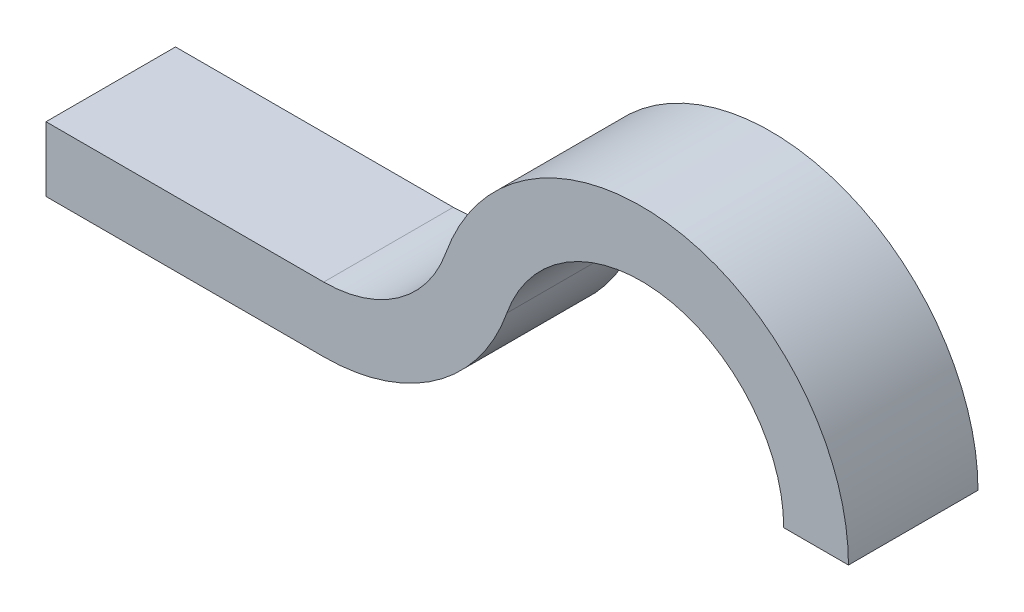
ISO-10303-21;
HEADER;
FILE_DESCRIPTION(('STEP AP214'),'2;1');
FILE_NAME('part.step','',(''),(''),'','','');
FILE_SCHEMA(('AUTOMOTIVE_DESIGN { 1 0 10303 214 1 1 1 1 }'));
ENDSEC;
DATA;
#1=APPLICATION_CONTEXT('core data for automotive mechanical design processes');
#2=APPLICATION_PROTOCOL_DEFINITION('international standard','automotive_design',2000,#1);
#3=PRODUCT_CONTEXT('',#1,'mechanical');
#4=PRODUCT('Part','Part','',(#3));
#5=PRODUCT_RELATED_PRODUCT_CATEGORY('part','',(#4));
#6=PRODUCT_DEFINITION_FORMATION('','',#4);
#7=PRODUCT_DEFINITION_CONTEXT('part definition',#1,'design');
#8=PRODUCT_DEFINITION('design','',#6,#7);
#9=PRODUCT_DEFINITION_SHAPE('','',#8);
#10=(LENGTH_UNIT() NAMED_UNIT(*) SI_UNIT(.MILLI.,.METRE.));
#11=(NAMED_UNIT(*) PLANE_ANGLE_UNIT() SI_UNIT($,.RADIAN.));
#12=(NAMED_UNIT(*) SI_UNIT($,.STERADIAN.) SOLID_ANGLE_UNIT());
#13=UNCERTAINTY_MEASURE_WITH_UNIT(LENGTH_MEASURE(1.E-05),#10,'distance_accuracy_value','');
#14=(GEOMETRIC_REPRESENTATION_CONTEXT(3) GLOBAL_UNCERTAINTY_ASSIGNED_CONTEXT((#13)) GLOBAL_UNIT_ASSIGNED_CONTEXT((#10,
#11,#12)) REPRESENTATION_CONTEXT('',''));
#15=CARTESIAN_POINT('',(0.,0.,0.));
#16=DIRECTION('',(0.,0.,1.));
#17=DIRECTION('',(1.,0.,0.));
#18=AXIS2_PLACEMENT_3D('',#15,#16,#17);
#19=CARTESIAN_POINT('',(0.,0.,10.));
#20=DIRECTION('',(0.,0.,-1.));
#21=DIRECTION('',(-1.,0.,0.));
#22=AXIS2_PLACEMENT_3D('',#19,#20,#21);
#23=CYLINDRICAL_SURFACE('',#22,16.);
#24=CARTESIAN_POINT('',(0.,0.,0.));
#25=DIRECTION('',(0.,0.,1.));
#26=DIRECTION('',(-1.,0.,0.));
#27=AXIS2_PLACEMENT_3D('',#24,#25,#26);
#28=CIRCLE('',#27,16.);
#29=CARTESIAN_POINT('',(16.,0.,0.));
#30=VERTEX_POINT('',#29);
#31=CARTESIAN_POINT('',(-15.084944665313,5.33333333333333,0.));
#32=VERTEX_POINT('',#31);
#33=EDGE_CURVE('E133',#30,#32,#28,.T.);
#34=ORIENTED_EDGE('',*,*,#33,.T.);
#35=DIRECTION('',(0.,0.,-1.));
#36=VECTOR('',#35,1.);
#37=CARTESIAN_POINT('',(-15.084944665313,5.33333333333333,10.));
#38=LINE('',#37,#36);
#39=CARTESIAN_POINT('',(-15.084944665313,5.33333333333333,10.));
#40=VERTEX_POINT('',#39);
#41=EDGE_CURVE('E11',#40,#32,#38,.T.);
#42=ORIENTED_EDGE('',*,*,#41,.F.);
#43=CARTESIAN_POINT('',(0.,0.,10.));
#44=DIRECTION('',(0.,0.,1.));
#45=DIRECTION('',(-1.,0.,0.));
#46=AXIS2_PLACEMENT_3D('',#43,#44,#45);
#47=CIRCLE('',#46,16.);
#48=CARTESIAN_POINT('',(16.,0.,10.));
#49=VERTEX_POINT('',#48);
#50=EDGE_CURVE('E147',#49,#40,#47,.T.);
#51=ORIENTED_EDGE('',*,*,#50,.F.);
#52=DIRECTION('',(0.,0.,-1.));
#53=VECTOR('',#52,1.);
#54=CARTESIAN_POINT('',(16.,0.,10.));
#55=LINE('',#54,#53);
#56=EDGE_CURVE('E129',#49,#30,#55,.T.);
#57=ORIENTED_EDGE('',*,*,#56,.T.);
#58=EDGE_LOOP('',(#34,#42,#51,#57));
#59=FACE_BOUND('',#58,.T.);
#60=ADVANCED_FACE('F37',(#59),#23,.T.);
#61=CARTESIAN_POINT('',(-24.5130350811337,8.66666666666667,10.));
#62=DIRECTION('',(0.,0.,-1.));
#63=DIRECTION('',(-1.,0.,0.));
#64=AXIS2_PLACEMENT_3D('',#61,#62,#63);
#65=CYLINDRICAL_SURFACE('',#64,10.);
#66=CARTESIAN_POINT('',(-24.5130350811337,8.66666666666667,0.));
#67=DIRECTION('',(0.,0.,-1.));
#68=DIRECTION('',(-1.,0.,0.));
#69=AXIS2_PLACEMENT_3D('',#66,#67,#68);
#70=CIRCLE('',#69,10.);
#71=CARTESIAN_POINT('',(-24.5130350811337,-1.33333333333333,0.));
#72=VERTEX_POINT('',#71);
#73=EDGE_CURVE('E136',#32,#72,#70,.T.);
#74=ORIENTED_EDGE('',*,*,#73,.T.);
#75=DIRECTION('',(0.,0.,-1.));
#76=VECTOR('',#75,1.);
#77=CARTESIAN_POINT('',(-24.5130350811337,-1.33333333333333,10.));
#78=LINE('',#77,#76);
#79=CARTESIAN_POINT('',(-24.5130350811337,-1.33333333333333,10.));
#80=VERTEX_POINT('',#79);
#81=EDGE_CURVE('E45',#80,#72,#78,.T.);
#82=ORIENTED_EDGE('',*,*,#81,.F.);
#83=CARTESIAN_POINT('',(-24.5130350811337,8.66666666666667,10.));
#84=DIRECTION('',(0.,0.,-1.));
#85=DIRECTION('',(-1.,0.,0.));
#86=AXIS2_PLACEMENT_3D('',#83,#84,#85);
#87=CIRCLE('',#86,10.);
#88=EDGE_CURVE('E96',#40,#80,#87,.T.);
#89=ORIENTED_EDGE('',*,*,#88,.F.);
#90=ORIENTED_EDGE('',*,*,#41,.T.);
#91=EDGE_LOOP('',(#74,#82,#89,#90));
#92=FACE_BOUND('',#91,.T.);
#93=ADVANCED_FACE('F182',(#92),#65,.F.);
#94=CARTESIAN_POINT('',(-24.5130350811337,-1.33333333333333,10.));
#95=DIRECTION('',(0.,-1.,0.));
#96=DIRECTION('',(1.,0.,0.));
#97=AXIS2_PLACEMENT_3D('',#94,#95,#96);
#98=PLANE('',#97);
#99=DIRECTION('',(-1.,0.,0.));
#100=VECTOR('',#99,1.);
#101=CARTESIAN_POINT('',(-24.5130350811337,-1.33333333333333,0.));
#102=LINE('',#101,#100);
#103=CARTESIAN_POINT('',(-45.9535701403111,-1.33333333333334,0.));
#104=VERTEX_POINT('',#103);
#105=EDGE_CURVE('E138',#72,#104,#102,.T.);
#106=ORIENTED_EDGE('',*,*,#105,.T.);
#107=DIRECTION('',(0.,0.,-1.));
#108=VECTOR('',#107,1.);
#109=CARTESIAN_POINT('',(-45.9535701403111,-1.33333333333334,10.));
#110=LINE('',#109,#108);
#111=CARTESIAN_POINT('',(-45.9535701403111,-1.33333333333334,10.));
#112=VERTEX_POINT('',#111);
#113=EDGE_CURVE('E154',#112,#104,#110,.T.);
#114=ORIENTED_EDGE('',*,*,#113,.F.);
#115=DIRECTION('',(-1.,0.,0.));
#116=VECTOR('',#115,1.);
#117=CARTESIAN_POINT('',(-24.5130350811337,-1.33333333333333,10.));
#118=LINE('',#117,#116);
#119=EDGE_CURVE('E162',#80,#112,#118,.T.);
#120=ORIENTED_EDGE('',*,*,#119,.F.);
#121=ORIENTED_EDGE('',*,*,#81,.T.);
#122=EDGE_LOOP('',(#106,#114,#120,#121));
#123=FACE_BOUND('',#122,.T.);
#124=ADVANCED_FACE('F160',(#123),#98,.F.);
#125=CARTESIAN_POINT('',(-45.9535701403111,-1.33333333333334,10.));
#126=DIRECTION('',(1.,0.,0.));
#127=DIRECTION('',(0.,0.,-1.));
#128=AXIS2_PLACEMENT_3D('',#125,#126,#127);
#129=PLANE('',#128);
#130=DIRECTION('',(0.,-1.,0.));
#131=VECTOR('',#130,1.);
#132=CARTESIAN_POINT('',(-45.9535701403111,-1.33333333333334,0.));
#133=LINE('',#132,#131);
#134=CARTESIAN_POINT('',(-45.9535701403111,-6.33333333333334,0.));
#135=VERTEX_POINT('',#134);
#136=EDGE_CURVE('E140',#104,#135,#133,.T.);
#137=ORIENTED_EDGE('',*,*,#136,.T.);
#138=DIRECTION('',(0.,0.,-1.));
#139=VECTOR('',#138,1.);
#140=CARTESIAN_POINT('',(-45.9535701403111,-6.33333333333334,10.));
#141=LINE('',#140,#139);
#142=CARTESIAN_POINT('',(-45.9535701403111,-6.33333333333334,10.));
#143=VERTEX_POINT('',#142);
#144=EDGE_CURVE('E151',#143,#135,#141,.T.);
#145=ORIENTED_EDGE('',*,*,#144,.F.);
#146=DIRECTION('',(0.,-1.,0.));
#147=VECTOR('',#146,1.);
#148=CARTESIAN_POINT('',(-45.9535701403111,-1.33333333333334,10.));
#149=LINE('',#148,#147);
#150=EDGE_CURVE('E174',#112,#143,#149,.T.);
#151=ORIENTED_EDGE('',*,*,#150,.F.);
#152=ORIENTED_EDGE('',*,*,#113,.T.);
#153=EDGE_LOOP('',(#137,#145,#151,#152));
#154=FACE_BOUND('',#153,.T.);
#155=ADVANCED_FACE('F170',(#154),#129,.F.);
#156=CARTESIAN_POINT('',(-24.5130350811336,-6.33333333333333,10.));
#157=DIRECTION('',(0.,1.,0.));
#158=DIRECTION('',(-1.,0.,0.));
#159=AXIS2_PLACEMENT_3D('',#156,#157,#158);
#160=PLANE('',#159);
#161=DIRECTION('',(1.,0.,0.));
#162=VECTOR('',#161,1.);
#163=CARTESIAN_POINT('',(-24.5130350811336,-6.33333333333333,0.));
#164=LINE('',#163,#162);
#165=CARTESIAN_POINT('',(-24.5130350811336,-6.33333333333333,0.));
#166=VERTEX_POINT('',#165);
#167=EDGE_CURVE('E142',#135,#166,#164,.T.);
#168=ORIENTED_EDGE('',*,*,#167,.T.);
#169=DIRECTION('',(0.,0.,-1.));
#170=VECTOR('',#169,1.);
#171=CARTESIAN_POINT('',(-24.5130350811336,-6.33333333333333,10.));
#172=LINE('',#171,#170);
#173=CARTESIAN_POINT('',(-24.5130350811336,-6.33333333333333,10.));
#174=VERTEX_POINT('',#173);
#175=EDGE_CURVE('E124',#174,#166,#172,.T.);
#176=ORIENTED_EDGE('',*,*,#175,.F.);
#177=DIRECTION('',(1.,0.,0.));
#178=VECTOR('',#177,1.);
#179=CARTESIAN_POINT('',(-24.5130350811336,-6.33333333333333,10.));
#180=LINE('',#179,#178);
#181=EDGE_CURVE('E115',#143,#174,#180,.T.);
#182=ORIENTED_EDGE('',*,*,#181,.F.);
#183=ORIENTED_EDGE('',*,*,#144,.T.);
#184=EDGE_LOOP('',(#168,#176,#182,#183));
#185=FACE_BOUND('',#184,.T.);
#186=ADVANCED_FACE('F173',(#185),#160,.F.);
#187=CARTESIAN_POINT('',(-24.5130350811337,8.66666666666667,10.));
#188=DIRECTION('',(0.,0.,-1.));
#189=DIRECTION('',(-1.,0.,0.));
#190=AXIS2_PLACEMENT_3D('',#187,#188,#189);
#191=CYLINDRICAL_SURFACE('',#190,15.);
#192=CARTESIAN_POINT('',(-24.5130350811337,8.66666666666667,0.));
#193=DIRECTION('',(0.,0.,1.));
#194=DIRECTION('',(-1.,0.,0.));
#195=AXIS2_PLACEMENT_3D('',#192,#193,#194);
#196=CIRCLE('',#195,15.);
#197=CARTESIAN_POINT('',(-10.3708994574027,3.66666666666667,0.));
#198=VERTEX_POINT('',#197);
#199=EDGE_CURVE('E123',#166,#198,#196,.T.);
#200=ORIENTED_EDGE('',*,*,#199,.T.);
#201=DIRECTION('',(0.,0.,-1.));
#202=VECTOR('',#201,1.);
#203=CARTESIAN_POINT('',(-10.3708994574027,3.66666666666667,10.));
#204=LINE('',#203,#202);
#205=CARTESIAN_POINT('',(-10.3708994574027,3.66666666666667,10.));
#206=VERTEX_POINT('',#205);
#207=EDGE_CURVE('E120',#206,#198,#204,.T.);
#208=ORIENTED_EDGE('',*,*,#207,.F.);
#209=CARTESIAN_POINT('',(-24.5130350811337,8.66666666666667,10.));
#210=DIRECTION('',(0.,0.,1.));
#211=DIRECTION('',(-1.,0.,0.));
#212=AXIS2_PLACEMENT_3D('',#209,#210,#211);
#213=CIRCLE('',#212,15.);
#214=EDGE_CURVE('E109',#174,#206,#213,.T.);
#215=ORIENTED_EDGE('',*,*,#214,.F.);
#216=ORIENTED_EDGE('',*,*,#175,.T.);
#217=EDGE_LOOP('',(#200,#208,#215,#216));
#218=FACE_BOUND('',#217,.T.);
#219=ADVANCED_FACE('F121',(#218),#191,.T.);
#220=CARTESIAN_POINT('',(0.,0.,10.));
#221=DIRECTION('',(0.,0.,-1.));
#222=DIRECTION('',(-1.,0.,0.));
#223=AXIS2_PLACEMENT_3D('',#220,#221,#222);
#224=CYLINDRICAL_SURFACE('',#223,11.);
#225=CARTESIAN_POINT('',(0.,0.,0.));
#226=DIRECTION('',(0.,0.,-1.));
#227=DIRECTION('',(-1.,0.,0.));
#228=AXIS2_PLACEMENT_3D('',#225,#226,#227);
#229=CIRCLE('',#228,11.);
#230=CARTESIAN_POINT('',(11.,0.,0.));
#231=VERTEX_POINT('',#230);
#232=EDGE_CURVE('E82',#198,#231,#229,.T.);
#233=ORIENTED_EDGE('',*,*,#232,.T.);
#234=DIRECTION('',(0.,0.,-1.));
#235=VECTOR('',#234,1.);
#236=CARTESIAN_POINT('',(11.,0.,10.));
#237=LINE('',#236,#235);
#238=CARTESIAN_POINT('',(11.,0.,10.));
#239=VERTEX_POINT('',#238);
#240=EDGE_CURVE('E125',#239,#231,#237,.T.);
#241=ORIENTED_EDGE('',*,*,#240,.F.);
#242=CARTESIAN_POINT('',(0.,0.,10.));
#243=DIRECTION('',(0.,0.,-1.));
#244=DIRECTION('',(-1.,0.,0.));
#245=AXIS2_PLACEMENT_3D('',#242,#243,#244);
#246=CIRCLE('',#245,11.);
#247=EDGE_CURVE('E113',#206,#239,#246,.T.);
#248=ORIENTED_EDGE('',*,*,#247,.F.);
#249=ORIENTED_EDGE('',*,*,#207,.T.);
#250=EDGE_LOOP('',(#233,#241,#248,#249));
#251=FACE_BOUND('',#250,.T.);
#252=ADVANCED_FACE('F127',(#251),#224,.F.);
#253=CARTESIAN_POINT('',(16.,0.,10.));
#254=DIRECTION('',(0.,1.,0.));
#255=DIRECTION('',(-1.,0.,0.));
#256=AXIS2_PLACEMENT_3D('',#253,#254,#255);
#257=PLANE('',#256);
#258=DIRECTION('',(1.,0.,0.));
#259=VECTOR('',#258,1.);
#260=CARTESIAN_POINT('',(16.,0.,0.));
#261=LINE('',#260,#259);
#262=EDGE_CURVE('E88',#231,#30,#261,.T.);
#263=ORIENTED_EDGE('',*,*,#262,.T.);
#264=ORIENTED_EDGE('',*,*,#56,.F.);
#265=DIRECTION('',(1.,0.,0.));
#266=VECTOR('',#265,1.);
#267=CARTESIAN_POINT('',(16.,0.,10.));
#268=LINE('',#267,#266);
#269=EDGE_CURVE('E53',#239,#49,#268,.T.);
#270=ORIENTED_EDGE('',*,*,#269,.F.);
#271=ORIENTED_EDGE('',*,*,#240,.T.);
#272=EDGE_LOOP('',(#263,#264,#270,#271));
#273=FACE_BOUND('',#272,.T.);
#274=ADVANCED_FACE('F198',(#273),#257,.F.);
#275=CARTESIAN_POINT('',(0.,0.,10.));
#276=DIRECTION('',(0.,0.,-1.));
#277=DIRECTION('',(-1.,0.,0.));
#278=AXIS2_PLACEMENT_3D('',#275,#276,#277);
#279=PLANE('',#278);
#280=ORIENTED_EDGE('',*,*,#50,.T.);
#281=ORIENTED_EDGE('',*,*,#88,.T.);
#282=ORIENTED_EDGE('',*,*,#119,.T.);
#283=ORIENTED_EDGE('',*,*,#150,.T.);
#284=ORIENTED_EDGE('',*,*,#181,.T.);
#285=ORIENTED_EDGE('',*,*,#214,.T.);
#286=ORIENTED_EDGE('',*,*,#247,.T.);
#287=ORIENTED_EDGE('',*,*,#269,.T.);
#288=EDGE_LOOP('',(#280,#281,#282,#283,#284,#285,#286,#287));
#289=FACE_BOUND('',#288,.T.);
#290=ADVANCED_FACE('F111',(#289),#279,.F.);
#291=CARTESIAN_POINT('',(0.,0.,0.));
#292=DIRECTION('',(0.,0.,-1.));
#293=DIRECTION('',(-1.,0.,0.));
#294=AXIS2_PLACEMENT_3D('',#291,#292,#293);
#295=PLANE('',#294);
#296=ORIENTED_EDGE('',*,*,#33,.F.);
#297=ORIENTED_EDGE('',*,*,#262,.F.);
#298=ORIENTED_EDGE('',*,*,#232,.F.);
#299=ORIENTED_EDGE('',*,*,#199,.F.);
#300=ORIENTED_EDGE('',*,*,#167,.F.);
#301=ORIENTED_EDGE('',*,*,#136,.F.);
#302=ORIENTED_EDGE('',*,*,#105,.F.);
#303=ORIENTED_EDGE('',*,*,#73,.F.);
#304=EDGE_LOOP('',(#296,#297,#298,#299,#300,#301,#302,#303));
#305=FACE_BOUND('',#304,.T.);
#306=ADVANCED_FACE('F166',(#305),#295,.T.);
#307=CLOSED_SHELL('',(#60,#93,#124,#155,#186,#219,#252,#274,#290,#306));
#308=MANIFOLD_SOLID_BREP('B2',#307);
#309=ADVANCED_BREP_SHAPE_REPRESENTATION('',(#18,#308),#14);
#310=SHAPE_DEFINITION_REPRESENTATION(#9,#309);
ENDSEC;
END-ISO-10303-21;
